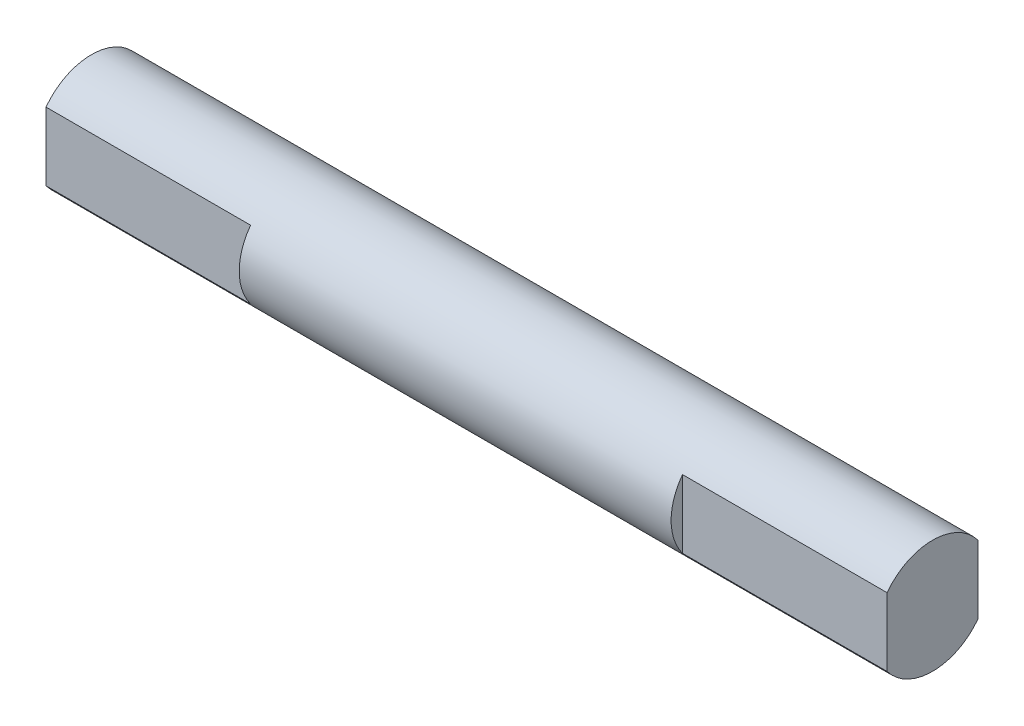
ISO-10303-21;
HEADER;
FILE_DESCRIPTION(('STEP AP214'),'2;1');
FILE_NAME('part.step','',(''),(''),'','','');
FILE_SCHEMA(('AUTOMOTIVE_DESIGN { 1 0 10303 214 1 1 1 1 }'));
ENDSEC;
DATA;
#1=APPLICATION_CONTEXT('core data for automotive mechanical design processes');
#2=APPLICATION_PROTOCOL_DEFINITION('international standard','automotive_design',2000,#1);
#3=PRODUCT_CONTEXT('',#1,'mechanical');
#4=PRODUCT('Part','Part','',(#3));
#5=PRODUCT_RELATED_PRODUCT_CATEGORY('part','',(#4));
#6=PRODUCT_DEFINITION_FORMATION('','',#4);
#7=PRODUCT_DEFINITION_CONTEXT('part definition',#1,'design');
#8=PRODUCT_DEFINITION('design','',#6,#7);
#9=PRODUCT_DEFINITION_SHAPE('','',#8);
#10=(LENGTH_UNIT() NAMED_UNIT(*) SI_UNIT(.MILLI.,.METRE.));
#11=(NAMED_UNIT(*) PLANE_ANGLE_UNIT() SI_UNIT($,.RADIAN.));
#12=(NAMED_UNIT(*) SI_UNIT($,.STERADIAN.) SOLID_ANGLE_UNIT());
#13=UNCERTAINTY_MEASURE_WITH_UNIT(LENGTH_MEASURE(1.E-05),#10,'distance_accuracy_value','');
#14=(GEOMETRIC_REPRESENTATION_CONTEXT(3) GLOBAL_UNCERTAINTY_ASSIGNED_CONTEXT((#13)) GLOBAL_UNIT_ASSIGNED_CONTEXT((#10,
#11,#12)) REPRESENTATION_CONTEXT('',''));
#15=CARTESIAN_POINT('',(0.,0.,0.));
#16=DIRECTION('',(0.,0.,1.));
#17=DIRECTION('',(1.,0.,0.));
#18=AXIS2_PLACEMENT_3D('',#15,#16,#17);
#19=CARTESIAN_POINT('',(-9.5,0.,0.));
#20=DIRECTION('',(1.,0.,0.));
#21=DIRECTION('',(0.,0.,-1.));
#22=AXIS2_PLACEMENT_3D('',#19,#20,#21);
#23=PLANE('',#22);
#24=CARTESIAN_POINT('',(-9.5,0.,0.));
#25=DIRECTION('',(1.,0.,0.));
#26=DIRECTION('',(0.,0.,-1.));
#27=AXIS2_PLACEMENT_3D('',#24,#25,#26);
#28=CIRCLE('',#27,2.5);
#29=CARTESIAN_POINT('',(-9.5,1.5,2.));
#30=VERTEX_POINT('',#29);
#31=CARTESIAN_POINT('',(-9.5,-1.5,2.));
#32=VERTEX_POINT('',#31);
#33=EDGE_CURVE('E194',#30,#32,#28,.T.);
#34=ORIENTED_EDGE('',*,*,#33,.F.);
#35=DIRECTION('',(0.,-1.,0.));
#36=VECTOR('',#35,1.);
#37=CARTESIAN_POINT('',(-9.5,1.5,2.));
#38=LINE('',#37,#36);
#39=EDGE_CURVE('E135',#30,#32,#38,.T.);
#40=ORIENTED_EDGE('',*,*,#39,.T.);
#41=EDGE_LOOP('',(#34,#40));
#42=FACE_BOUND('',#41,.T.);
#43=ADVANCED_FACE('F51',(#42),#23,.F.);
#44=CARTESIAN_POINT('',(9.5,0.,0.));
#45=DIRECTION('',(1.,0.,0.));
#46=DIRECTION('',(0.,0.,-1.));
#47=AXIS2_PLACEMENT_3D('',#44,#45,#46);
#48=PLANE('',#47);
#49=DIRECTION('',(0.,1.,0.));
#50=VECTOR('',#49,1.);
#51=CARTESIAN_POINT('',(9.5,1.5,-2.));
#52=LINE('',#51,#50);
#53=CARTESIAN_POINT('',(9.5,-1.5,-2.));
#54=VERTEX_POINT('',#53);
#55=CARTESIAN_POINT('',(9.5,1.5,-2.));
#56=VERTEX_POINT('',#55);
#57=EDGE_CURVE('E75',#54,#56,#52,.T.);
#58=ORIENTED_EDGE('',*,*,#57,.F.);
#59=CARTESIAN_POINT('',(9.5,0.,0.));
#60=DIRECTION('',(1.,0.,0.));
#61=DIRECTION('',(0.,0.,-1.));
#62=AXIS2_PLACEMENT_3D('',#59,#60,#61);
#63=CIRCLE('',#62,2.5);
#64=EDGE_CURVE('E61',#54,#56,#63,.T.);
#65=ORIENTED_EDGE('',*,*,#64,.T.);
#66=EDGE_LOOP('',(#58,#65));
#67=FACE_BOUND('',#66,.T.);
#68=ADVANCED_FACE('F213',(#67),#48,.T.);
#69=CARTESIAN_POINT('',(9.5,0.,0.));
#70=DIRECTION('',(-1.,0.,0.));
#71=DIRECTION('',(0.,0.,1.));
#72=AXIS2_PLACEMENT_3D('',#69,#70,#71);
#73=CYLINDRICAL_SURFACE('',#72,2.5);
#74=CARTESIAN_POINT('',(9.5,1.5,2.));
#75=VERTEX_POINT('',#74);
#76=CARTESIAN_POINT('',(9.5,-1.5,2.));
#77=VERTEX_POINT('',#76);
#78=EDGE_CURVE('E11',#75,#77,#63,.T.);
#79=ORIENTED_EDGE('',*,*,#78,.F.);
#80=DIRECTION('',(-1.,0.,0.));
#81=VECTOR('',#80,1.);
#82=CARTESIAN_POINT('',(18.5,1.5,2.));
#83=LINE('',#82,#81);
#84=CARTESIAN_POINT('',(18.5,1.5,2.));
#85=VERTEX_POINT('',#84);
#86=EDGE_CURVE('E190',#85,#75,#83,.T.);
#87=ORIENTED_EDGE('',*,*,#86,.F.);
#88=CARTESIAN_POINT('',(18.5,0.,0.));
#89=DIRECTION('',(1.,0.,0.));
#90=DIRECTION('',(0.,0.,-1.));
#91=AXIS2_PLACEMENT_3D('',#88,#89,#90);
#92=CIRCLE('',#91,2.5);
#93=CARTESIAN_POINT('',(18.5,1.5,-2.));
#94=VERTEX_POINT('',#93);
#95=EDGE_CURVE('E160',#94,#85,#92,.T.);
#96=ORIENTED_EDGE('',*,*,#95,.F.);
#97=DIRECTION('',(-1.,0.,0.));
#98=VECTOR('',#97,1.);
#99=CARTESIAN_POINT('',(18.5,1.5,-2.));
#100=LINE('',#99,#98);
#101=EDGE_CURVE('E173',#94,#56,#100,.T.);
#102=ORIENTED_EDGE('',*,*,#101,.T.);
#103=ORIENTED_EDGE('',*,*,#64,.F.);
#104=DIRECTION('',(-1.,0.,0.));
#105=VECTOR('',#104,1.);
#106=CARTESIAN_POINT('',(18.5,-1.5,-2.));
#107=LINE('',#106,#105);
#108=CARTESIAN_POINT('',(18.5,-1.5,-2.));
#109=VERTEX_POINT('',#108);
#110=EDGE_CURVE('E182',#109,#54,#107,.T.);
#111=ORIENTED_EDGE('',*,*,#110,.F.);
#112=CARTESIAN_POINT('',(18.5,0.,0.));
#113=DIRECTION('',(1.,0.,0.));
#114=DIRECTION('',(0.,0.,-1.));
#115=AXIS2_PLACEMENT_3D('',#112,#113,#114);
#116=CIRCLE('',#115,2.5);
#117=CARTESIAN_POINT('',(18.5,-1.5,2.));
#118=VERTEX_POINT('',#117);
#119=EDGE_CURVE('E167',#118,#109,#116,.T.);
#120=ORIENTED_EDGE('',*,*,#119,.F.);
#121=DIRECTION('',(-1.,0.,0.));
#122=VECTOR('',#121,1.);
#123=CARTESIAN_POINT('',(18.5,-1.5,2.));
#124=LINE('',#123,#122);
#125=EDGE_CURVE('E186',#118,#77,#124,.T.);
#126=ORIENTED_EDGE('',*,*,#125,.T.);
#127=EDGE_LOOP('',(#79,#87,#96,#102,#103,#111,#120,#126));
#128=FACE_BOUND('',#127,.T.);
#129=CARTESIAN_POINT('',(-9.5,-1.5,-2.));
#130=VERTEX_POINT('',#129);
#131=CARTESIAN_POINT('',(-9.5,1.5,-2.));
#132=VERTEX_POINT('',#131);
#133=EDGE_CURVE('E55',#130,#132,#28,.T.);
#134=ORIENTED_EDGE('',*,*,#133,.T.);
#135=DIRECTION('',(1.,0.,0.));
#136=VECTOR('',#135,1.);
#137=CARTESIAN_POINT('',(-18.5,1.5,-2.));
#138=LINE('',#137,#136);
#139=CARTESIAN_POINT('',(-18.5,1.5,-2.));
#140=VERTEX_POINT('',#139);
#141=EDGE_CURVE('E68',#140,#132,#138,.T.);
#142=ORIENTED_EDGE('',*,*,#141,.F.);
#143=CARTESIAN_POINT('',(-18.5,0.,0.));
#144=DIRECTION('',(1.,0.,0.));
#145=DIRECTION('',(0.,0.,-1.));
#146=AXIS2_PLACEMENT_3D('',#143,#144,#145);
#147=CIRCLE('',#146,2.5);
#148=CARTESIAN_POINT('',(-18.5,1.5,2.));
#149=VERTEX_POINT('',#148);
#150=EDGE_CURVE('E119',#140,#149,#147,.T.);
#151=ORIENTED_EDGE('',*,*,#150,.T.);
#152=DIRECTION('',(1.,0.,0.));
#153=VECTOR('',#152,1.);
#154=CARTESIAN_POINT('',(-18.5,1.5,2.));
#155=LINE('',#154,#153);
#156=EDGE_CURVE('E146',#149,#30,#155,.T.);
#157=ORIENTED_EDGE('',*,*,#156,.T.);
#158=ORIENTED_EDGE('',*,*,#33,.T.);
#159=DIRECTION('',(1.,0.,0.));
#160=VECTOR('',#159,1.);
#161=CARTESIAN_POINT('',(-18.5,-1.5,2.));
#162=LINE('',#161,#160);
#163=CARTESIAN_POINT('',(-18.5,-1.5,2.));
#164=VERTEX_POINT('',#163);
#165=EDGE_CURVE('E155',#164,#32,#162,.T.);
#166=ORIENTED_EDGE('',*,*,#165,.F.);
#167=CARTESIAN_POINT('',(-18.5,0.,0.));
#168=DIRECTION('',(1.,0.,0.));
#169=DIRECTION('',(0.,0.,-1.));
#170=AXIS2_PLACEMENT_3D('',#167,#168,#169);
#171=CIRCLE('',#170,2.5);
#172=CARTESIAN_POINT('',(-18.5,-1.5,-2.));
#173=VERTEX_POINT('',#172);
#174=EDGE_CURVE('E139',#164,#173,#171,.T.);
#175=ORIENTED_EDGE('',*,*,#174,.T.);
#176=DIRECTION('',(1.,0.,0.));
#177=VECTOR('',#176,1.);
#178=CARTESIAN_POINT('',(-18.5,-1.5,-2.));
#179=LINE('',#178,#177);
#180=EDGE_CURVE('E124',#173,#130,#179,.T.);
#181=ORIENTED_EDGE('',*,*,#180,.T.);
#182=EDGE_LOOP('',(#134,#142,#151,#157,#158,#166,#175,#181));
#183=FACE_BOUND('',#182,.T.);
#184=ADVANCED_FACE('F53',(#128,#183),#73,.T.);
#185=DIRECTION('',(0.,-1.,0.));
#186=VECTOR('',#185,1.);
#187=CARTESIAN_POINT('',(9.5,1.5,2.));
#188=LINE('',#187,#186);
#189=EDGE_CURVE('E123',#75,#77,#188,.T.);
#190=ORIENTED_EDGE('',*,*,#189,.F.);
#191=ORIENTED_EDGE('',*,*,#78,.T.);
#192=EDGE_LOOP('',(#190,#191));
#193=FACE_BOUND('',#192,.T.);
#194=ADVANCED_FACE('F221',(#193),#48,.T.);
#195=ORIENTED_EDGE('',*,*,#133,.F.);
#196=DIRECTION('',(0.,1.,0.));
#197=VECTOR('',#196,1.);
#198=CARTESIAN_POINT('',(-9.5,1.5,-2.));
#199=LINE('',#198,#197);
#200=EDGE_CURVE('E147',#130,#132,#199,.T.);
#201=ORIENTED_EDGE('',*,*,#200,.T.);
#202=EDGE_LOOP('',(#195,#201));
#203=FACE_BOUND('',#202,.T.);
#204=ADVANCED_FACE('F214',(#203),#23,.F.);
#205=CARTESIAN_POINT('',(18.5,1.5,2.));
#206=DIRECTION('',(0.,0.,-1.));
#207=DIRECTION('',(-1.,0.,0.));
#208=AXIS2_PLACEMENT_3D('',#205,#206,#207);
#209=PLANE('',#208);
#210=ORIENTED_EDGE('',*,*,#189,.T.);
#211=ORIENTED_EDGE('',*,*,#125,.F.);
#212=DIRECTION('',(0.,-1.,0.));
#213=VECTOR('',#212,1.);
#214=CARTESIAN_POINT('',(18.5,1.5,2.));
#215=LINE('',#214,#213);
#216=EDGE_CURVE('E164',#85,#118,#215,.T.);
#217=ORIENTED_EDGE('',*,*,#216,.F.);
#218=ORIENTED_EDGE('',*,*,#86,.T.);
#219=EDGE_LOOP('',(#210,#211,#217,#218));
#220=FACE_BOUND('',#219,.T.);
#221=ADVANCED_FACE('F223',(#220),#209,.F.);
#222=CARTESIAN_POINT('',(18.5,1.5,-2.));
#223=DIRECTION('',(0.,0.,1.));
#224=DIRECTION('',(1.,0.,0.));
#225=AXIS2_PLACEMENT_3D('',#222,#223,#224);
#226=PLANE('',#225);
#227=ORIENTED_EDGE('',*,*,#57,.T.);
#228=ORIENTED_EDGE('',*,*,#101,.F.);
#229=DIRECTION('',(0.,1.,0.));
#230=VECTOR('',#229,1.);
#231=CARTESIAN_POINT('',(18.5,1.5,-2.));
#232=LINE('',#231,#230);
#233=EDGE_CURVE('E170',#109,#94,#232,.T.);
#234=ORIENTED_EDGE('',*,*,#233,.F.);
#235=ORIENTED_EDGE('',*,*,#110,.T.);
#236=EDGE_LOOP('',(#227,#228,#234,#235));
#237=FACE_BOUND('',#236,.T.);
#238=ADVANCED_FACE('F229',(#237),#226,.F.);
#239=CARTESIAN_POINT('',(18.5,0.,0.));
#240=DIRECTION('',(1.,0.,0.));
#241=DIRECTION('',(0.,0.,-1.));
#242=AXIS2_PLACEMENT_3D('',#239,#240,#241);
#243=PLANE('',#242);
#244=ORIENTED_EDGE('',*,*,#95,.T.);
#245=ORIENTED_EDGE('',*,*,#216,.T.);
#246=ORIENTED_EDGE('',*,*,#119,.T.);
#247=ORIENTED_EDGE('',*,*,#233,.T.);
#248=EDGE_LOOP('',(#244,#245,#246,#247));
#249=FACE_BOUND('',#248,.T.);
#250=ADVANCED_FACE('F210',(#249),#243,.T.);
#251=CARTESIAN_POINT('',(-18.5,1.5,-2.));
#252=DIRECTION('',(0.,0.,-1.));
#253=DIRECTION('',(-1.,0.,0.));
#254=AXIS2_PLACEMENT_3D('',#251,#252,#253);
#255=PLANE('',#254);
#256=ORIENTED_EDGE('',*,*,#200,.F.);
#257=ORIENTED_EDGE('',*,*,#180,.F.);
#258=DIRECTION('',(0.,1.,0.));
#259=VECTOR('',#258,1.);
#260=CARTESIAN_POINT('',(-18.5,1.5,-2.));
#261=LINE('',#260,#259);
#262=EDGE_CURVE('E130',#173,#140,#261,.T.);
#263=ORIENTED_EDGE('',*,*,#262,.T.);
#264=ORIENTED_EDGE('',*,*,#141,.T.);
#265=EDGE_LOOP('',(#256,#257,#263,#264));
#266=FACE_BOUND('',#265,.T.);
#267=ADVANCED_FACE('F137',(#266),#255,.T.);
#268=CARTESIAN_POINT('',(-18.5,1.5,2.));
#269=DIRECTION('',(0.,0.,1.));
#270=DIRECTION('',(1.,0.,0.));
#271=AXIS2_PLACEMENT_3D('',#268,#269,#270);
#272=PLANE('',#271);
#273=ORIENTED_EDGE('',*,*,#39,.F.);
#274=ORIENTED_EDGE('',*,*,#156,.F.);
#275=DIRECTION('',(0.,-1.,0.));
#276=VECTOR('',#275,1.);
#277=CARTESIAN_POINT('',(-18.5,1.5,2.));
#278=LINE('',#277,#276);
#279=EDGE_CURVE('E133',#149,#164,#278,.T.);
#280=ORIENTED_EDGE('',*,*,#279,.T.);
#281=ORIENTED_EDGE('',*,*,#165,.T.);
#282=EDGE_LOOP('',(#273,#274,#280,#281));
#283=FACE_BOUND('',#282,.T.);
#284=ADVANCED_FACE('F202',(#283),#272,.T.);
#285=CARTESIAN_POINT('',(-18.5,0.,0.));
#286=DIRECTION('',(-1.,0.,0.));
#287=DIRECTION('',(0.,0.,-1.));
#288=AXIS2_PLACEMENT_3D('',#285,#286,#287);
#289=PLANE('',#288);
#290=ORIENTED_EDGE('',*,*,#150,.F.);
#291=ORIENTED_EDGE('',*,*,#262,.F.);
#292=ORIENTED_EDGE('',*,*,#174,.F.);
#293=ORIENTED_EDGE('',*,*,#279,.F.);
#294=EDGE_LOOP('',(#290,#291,#292,#293));
#295=FACE_BOUND('',#294,.T.);
#296=ADVANCED_FACE('F128',(#295),#289,.T.);
#297=CLOSED_SHELL('',(#43,#68,#184,#194,#204,#221,#238,#250,#267,#284,#296));
#298=MANIFOLD_SOLID_BREP('B2',#297);
#299=ADVANCED_BREP_SHAPE_REPRESENTATION('',(#18,#298),#14);
#300=SHAPE_DEFINITION_REPRESENTATION(#9,#299);
ENDSEC;
END-ISO-10303-21;
